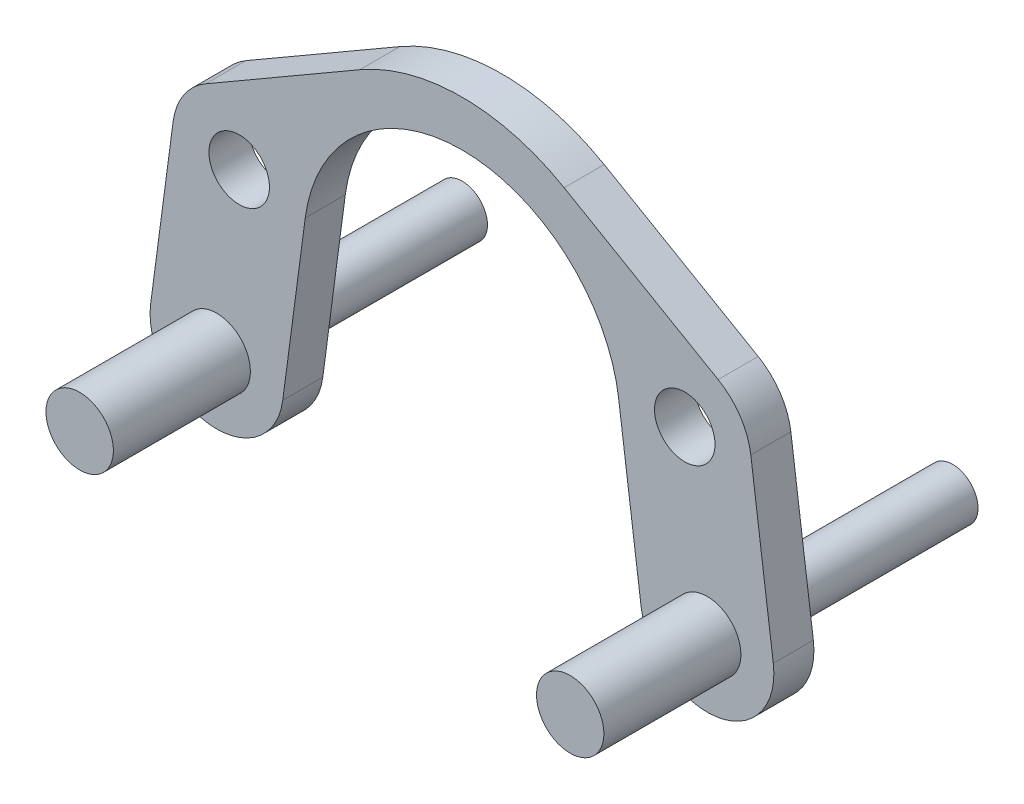
ISO-10303-21;
HEADER;
FILE_DESCRIPTION(('STEP AP214'),'2;1');
FILE_NAME('part.step','',(''),(''),'','','');
FILE_SCHEMA(('AUTOMOTIVE_DESIGN { 1 0 10303 214 1 1 1 1 }'));
ENDSEC;
DATA;
#1=APPLICATION_CONTEXT('core data for automotive mechanical design processes');
#2=APPLICATION_PROTOCOL_DEFINITION('international standard','automotive_design',2000,#1);
#3=PRODUCT_CONTEXT('',#1,'mechanical');
#4=PRODUCT('Part','Part','',(#3));
#5=PRODUCT_RELATED_PRODUCT_CATEGORY('part','',(#4));
#6=PRODUCT_DEFINITION_FORMATION('','',#4);
#7=PRODUCT_DEFINITION_CONTEXT('part definition',#1,'design');
#8=PRODUCT_DEFINITION('design','',#6,#7);
#9=PRODUCT_DEFINITION_SHAPE('','',#8);
#10=(LENGTH_UNIT() NAMED_UNIT(*) SI_UNIT(.MILLI.,.METRE.));
#11=(NAMED_UNIT(*) PLANE_ANGLE_UNIT() SI_UNIT($,.RADIAN.));
#12=(NAMED_UNIT(*) SI_UNIT($,.STERADIAN.) SOLID_ANGLE_UNIT());
#13=UNCERTAINTY_MEASURE_WITH_UNIT(LENGTH_MEASURE(1.E-05),#10,'distance_accuracy_value','');
#14=(GEOMETRIC_REPRESENTATION_CONTEXT(3) GLOBAL_UNCERTAINTY_ASSIGNED_CONTEXT((#13)) GLOBAL_UNIT_ASSIGNED_CONTEXT((#10,
#11,#12)) REPRESENTATION_CONTEXT('',''));
#15=CARTESIAN_POINT('',(0.,0.,0.));
#16=DIRECTION('',(0.,0.,1.));
#17=DIRECTION('',(1.,0.,0.));
#18=AXIS2_PLACEMENT_3D('',#15,#16,#17);
#19=CARTESIAN_POINT('',(0.,21.6913852657005,6.223));
#20=DIRECTION('',(0.,0.,1.));
#21=DIRECTION('',(1.,0.,0.));
#22=AXIS2_PLACEMENT_3D('',#19,#20,#21);
#23=PLANE('',#22);
#24=CARTESIAN_POINT('',(-38.1,0.,6.223));
#25=DIRECTION('',(0.,0.,1.));
#26=DIRECTION('',(1.,0.,0.));
#27=AXIS2_PLACEMENT_3D('',#24,#25,#26);
#28=CIRCLE('',#27,5.2324);
#29=CARTESIAN_POINT('',(-32.8676,0.,6.223));
#30=VERTEX_POINT('',#29);
#31=EDGE_CURVE('E41',#30,#30,#28,.T.);
#32=ORIENTED_EDGE('',*,*,#31,.F.);
#33=EDGE_LOOP('',(#32));
#34=FACE_BOUND('',#33,.T.);
#35=CARTESIAN_POINT('',(38.1,0.,6.223));
#36=DIRECTION('',(0.,0.,1.));
#37=DIRECTION('',(1.,0.,0.));
#38=AXIS2_PLACEMENT_3D('',#35,#36,#37);
#39=CIRCLE('',#38,5.2324);
#40=CARTESIAN_POINT('',(43.3324,0.,6.223));
#41=VERTEX_POINT('',#40);
#42=EDGE_CURVE('E216',#41,#41,#39,.T.);
#43=ORIENTED_EDGE('',*,*,#42,.F.);
#44=EDGE_LOOP('',(#43));
#45=FACE_BOUND('',#44,.T.);
#46=CARTESIAN_POINT('',(34.6075,26.289,6.223));
#47=DIRECTION('',(0.,0.,1.));
#48=DIRECTION('',(1.,0.,0.));
#49=AXIS2_PLACEMENT_3D('',#46,#47,#48);
#50=CIRCLE('',#49,4.699);
#51=CARTESIAN_POINT('',(39.3065,26.289,6.223));
#52=VERTEX_POINT('',#51);
#53=EDGE_CURVE('E158',#52,#52,#50,.T.);
#54=ORIENTED_EDGE('',*,*,#53,.F.);
#55=EDGE_LOOP('',(#54));
#56=FACE_BOUND('',#55,.T.);
#57=CARTESIAN_POINT('',(0.,21.6913852657005,6.223));
#58=DIRECTION('',(0.,0.,1.));
#59=DIRECTION('',(1.,0.,0.));
#60=AXIS2_PLACEMENT_3D('',#57,#58,#59);
#61=CIRCLE('',#60,31.6730613729183);
#62=CARTESIAN_POINT('',(15.8733700176392,49.0997588222573,6.223));
#63=VERTEX_POINT('',#62);
#64=CARTESIAN_POINT('',(-15.8733700176392,49.0997588222573,6.223));
#65=VERTEX_POINT('',#64);
#66=EDGE_CURVE('E178',#63,#65,#61,.T.);
#67=ORIENTED_EDGE('',*,*,#66,.T.);
#68=DIRECTION('',(-0.865352838295323,-0.501163112423718,0.));
#69=VECTOR('',#68,1.);
#70=CARTESIAN_POINT('',(-15.8733700176392,49.0997588222573,6.223));
#71=LINE('',#70,#69);
#72=CARTESIAN_POINT('',(-39.7947887951417,35.2458345527757,6.223));
#73=VERTEX_POINT('',#72);
#74=EDGE_CURVE('E105',#65,#73,#71,.T.);
#75=ORIENTED_EDGE('',*,*,#74,.T.);
#76=CARTESIAN_POINT('',(-34.6075,26.289,6.223));
#77=DIRECTION('',(0.,0.,1.));
#78=DIRECTION('',(-1.,0.,0.));
#79=AXIS2_PLACEMENT_3D('',#76,#77,#78);
#80=CIRCLE('',#79,10.3505);
#81=CARTESIAN_POINT('',(-44.8678525784403,27.6520903183918,6.223));
#82=VERTEX_POINT('',#81);
#83=EDGE_CURVE('E231',#73,#82,#80,.T.);
#84=ORIENTED_EDGE('',*,*,#83,.T.);
#85=DIRECTION('',(-0.131693185681061,-0.991290524944717,0.));
#86=VECTOR('',#85,1.);
#87=CARTESIAN_POINT('',(-48.3603525784403,1.36309031839182,6.223));
#88=LINE('',#87,#86);
#89=CARTESIAN_POINT('',(-48.3603525784403,1.36309031839182,6.223));
#90=VERTEX_POINT('',#89);
#91=EDGE_CURVE('E233',#82,#90,#88,.T.);
#92=ORIENTED_EDGE('',*,*,#91,.T.);
#93=CARTESIAN_POINT('',(-38.1,0.,6.223));
#94=DIRECTION('',(0.,0.,1.));
#95=DIRECTION('',(-1.,0.,0.));
#96=AXIS2_PLACEMENT_3D('',#93,#94,#95);
#97=CIRCLE('',#96,10.3505);
#98=CARTESIAN_POINT('',(-27.8396474215597,-1.36309031839182,6.223));
#99=VERTEX_POINT('',#98);
#100=EDGE_CURVE('E235',#90,#99,#97,.T.);
#101=ORIENTED_EDGE('',*,*,#100,.T.);
#102=DIRECTION('',(0.131693185681062,0.991290524944717,0.));
#103=VECTOR('',#102,1.);
#104=CARTESIAN_POINT('',(-27.8396474215597,-1.36309031839183,6.223));
#105=LINE('',#104,#103);
#106=CARTESIAN_POINT('',(-24.3471474215597,24.9259096816082,6.223));
#107=VERTEX_POINT('',#106);
#108=EDGE_CURVE('E237',#99,#107,#105,.T.);
#109=ORIENTED_EDGE('',*,*,#108,.T.);
#110=CARTESIAN_POINT('',(0.,21.6913852657005,6.223));
#111=DIRECTION('',(0.,0.,-1.));
#112=DIRECTION('',(-1.,0.,0.));
#113=AXIS2_PLACEMENT_3D('',#110,#111,#112);
#114=CIRCLE('',#113,24.5610613729184);
#115=CARTESIAN_POINT('',(24.3471474215597,24.9259096816082,6.223));
#116=VERTEX_POINT('',#115);
#117=EDGE_CURVE('E239',#107,#116,#114,.T.);
#118=ORIENTED_EDGE('',*,*,#117,.T.);
#119=DIRECTION('',(0.131693185681062,-0.991290524944717,0.));
#120=VECTOR('',#119,1.);
#121=CARTESIAN_POINT('',(27.8396474215597,-1.36309031839183,6.223));
#122=LINE('',#121,#120);
#123=CARTESIAN_POINT('',(27.8396474215597,-1.36309031839183,6.223));
#124=VERTEX_POINT('',#123);
#125=EDGE_CURVE('E241',#116,#124,#122,.T.);
#126=ORIENTED_EDGE('',*,*,#125,.T.);
#127=CARTESIAN_POINT('',(38.1,0.,6.223));
#128=DIRECTION('',(0.,0.,1.));
#129=DIRECTION('',(1.,0.,0.));
#130=AXIS2_PLACEMENT_3D('',#127,#128,#129);
#131=CIRCLE('',#130,10.3505);
#132=CARTESIAN_POINT('',(48.3603525784403,1.36309031839182,6.223));
#133=VERTEX_POINT('',#132);
#134=EDGE_CURVE('E136',#124,#133,#131,.T.);
#135=ORIENTED_EDGE('',*,*,#134,.T.);
#136=DIRECTION('',(-0.131693185681061,0.991290524944717,0.));
#137=VECTOR('',#136,1.);
#138=CARTESIAN_POINT('',(48.3603525784403,1.36309031839182,6.223));
#139=LINE('',#138,#137);
#140=CARTESIAN_POINT('',(44.8678525784403,27.6520903183918,6.223));
#141=VERTEX_POINT('',#140);
#142=EDGE_CURVE('E130',#133,#141,#139,.T.);
#143=ORIENTED_EDGE('',*,*,#142,.T.);
#144=CARTESIAN_POINT('',(34.6075,26.289,6.223));
#145=DIRECTION('',(0.,0.,1.));
#146=DIRECTION('',(1.,0.,0.));
#147=AXIS2_PLACEMENT_3D('',#144,#145,#146);
#148=CIRCLE('',#147,10.3505);
#149=CARTESIAN_POINT('',(39.7947887951417,35.2458345527757,6.223));
#150=VERTEX_POINT('',#149);
#151=EDGE_CURVE('E134',#141,#150,#148,.T.);
#152=ORIENTED_EDGE('',*,*,#151,.T.);
#153=DIRECTION('',(-0.865352838295323,0.501163112423718,0.));
#154=VECTOR('',#153,1.);
#155=CARTESIAN_POINT('',(15.8733700176392,49.0997588222573,6.223));
#156=LINE('',#155,#154);
#157=EDGE_CURVE('E49',#150,#63,#156,.T.);
#158=ORIENTED_EDGE('',*,*,#157,.T.);
#159=EDGE_LOOP('',(#67,#75,#84,#92,#101,#109,#118,#126,#135,#143,#152,#158));
#160=FACE_BOUND('',#159,.T.);
#161=CARTESIAN_POINT('',(-34.6075,26.289,6.223));
#162=DIRECTION('',(0.,0.,1.));
#163=DIRECTION('',(-1.,0.,0.));
#164=AXIS2_PLACEMENT_3D('',#161,#162,#163);
#165=CIRCLE('',#164,4.699);
#166=CARTESIAN_POINT('',(-39.3065,26.289,6.223));
#167=VERTEX_POINT('',#166);
#168=EDGE_CURVE('E223',#167,#167,#165,.T.);
#169=ORIENTED_EDGE('',*,*,#168,.F.);
#170=EDGE_LOOP('',(#169));
#171=FACE_BOUND('',#170,.T.);
#172=ADVANCED_FACE('F32',(#34,#45,#56,#160,#171),#23,.T.);
#173=CARTESIAN_POINT('',(0.,21.6913852657005,0.));
#174=DIRECTION('',(0.,0.,1.));
#175=DIRECTION('',(1.,0.,0.));
#176=AXIS2_PLACEMENT_3D('',#173,#174,#175);
#177=PLANE('',#176);
#178=CARTESIAN_POINT('',(38.1,0.,0.));
#179=DIRECTION('',(0.,0.,1.));
#180=DIRECTION('',(1.,0.,0.));
#181=AXIS2_PLACEMENT_3D('',#178,#179,#180);
#182=CIRCLE('',#181,3.937);
#183=CARTESIAN_POINT('',(42.037,0.,0.));
#184=VERTEX_POINT('',#183);
#185=EDGE_CURVE('E322',#184,#184,#182,.T.);
#186=ORIENTED_EDGE('',*,*,#185,.T.);
#187=EDGE_LOOP('',(#186));
#188=FACE_BOUND('',#187,.T.);
#189=CARTESIAN_POINT('',(-38.1,0.,0.));
#190=DIRECTION('',(0.,0.,1.));
#191=DIRECTION('',(1.,0.,0.));
#192=AXIS2_PLACEMENT_3D('',#189,#190,#191);
#193=CIRCLE('',#192,3.937);
#194=CARTESIAN_POINT('',(-34.163,0.,0.));
#195=VERTEX_POINT('',#194);
#196=EDGE_CURVE('E11',#195,#195,#193,.F.);
#197=ORIENTED_EDGE('',*,*,#196,.F.);
#198=EDGE_LOOP('',(#197));
#199=FACE_BOUND('',#198,.T.);
#200=CARTESIAN_POINT('',(0.,21.6913852657005,0.));
#201=DIRECTION('',(0.,0.,1.));
#202=DIRECTION('',(1.,0.,0.));
#203=AXIS2_PLACEMENT_3D('',#200,#201,#202);
#204=CIRCLE('',#203,31.6730613729183);
#205=CARTESIAN_POINT('',(15.8733700176392,49.0997588222573,0.));
#206=VERTEX_POINT('',#205);
#207=CARTESIAN_POINT('',(-15.8733700176392,49.0997588222573,0.));
#208=VERTEX_POINT('',#207);
#209=EDGE_CURVE('E154',#206,#208,#204,.T.);
#210=ORIENTED_EDGE('',*,*,#209,.F.);
#211=DIRECTION('',(-0.865352838295323,0.501163112423718,0.));
#212=VECTOR('',#211,1.);
#213=CARTESIAN_POINT('',(15.8733700176392,49.0997588222573,0.));
#214=LINE('',#213,#212);
#215=CARTESIAN_POINT('',(39.7947887951417,35.2458345527757,0.));
#216=VERTEX_POINT('',#215);
#217=EDGE_CURVE('E96',#216,#206,#214,.T.);
#218=ORIENTED_EDGE('',*,*,#217,.F.);
#219=CARTESIAN_POINT('',(34.6075,26.289,0.));
#220=DIRECTION('',(0.,0.,1.));
#221=DIRECTION('',(1.,0.,0.));
#222=AXIS2_PLACEMENT_3D('',#219,#220,#221);
#223=CIRCLE('',#222,10.3505);
#224=CARTESIAN_POINT('',(44.8678525784403,27.6520903183918,0.));
#225=VERTEX_POINT('',#224);
#226=EDGE_CURVE('E90',#225,#216,#223,.T.);
#227=ORIENTED_EDGE('',*,*,#226,.F.);
#228=DIRECTION('',(-0.131693185681061,0.991290524944717,0.));
#229=VECTOR('',#228,1.);
#230=CARTESIAN_POINT('',(48.3603525784403,1.36309031839182,0.));
#231=LINE('',#230,#229);
#232=CARTESIAN_POINT('',(48.3603525784403,1.36309031839182,0.));
#233=VERTEX_POINT('',#232);
#234=EDGE_CURVE('E144',#233,#225,#231,.T.);
#235=ORIENTED_EDGE('',*,*,#234,.F.);
#236=CARTESIAN_POINT('',(38.1,0.,0.));
#237=DIRECTION('',(0.,0.,1.));
#238=DIRECTION('',(1.,0.,0.));
#239=AXIS2_PLACEMENT_3D('',#236,#237,#238);
#240=CIRCLE('',#239,10.3505);
#241=CARTESIAN_POINT('',(27.8396474215597,-1.36309031839183,0.));
#242=VERTEX_POINT('',#241);
#243=EDGE_CURVE('E173',#242,#233,#240,.T.);
#244=ORIENTED_EDGE('',*,*,#243,.F.);
#245=DIRECTION('',(0.131693185681062,-0.991290524944717,0.));
#246=VECTOR('',#245,1.);
#247=CARTESIAN_POINT('',(27.8396474215597,-1.36309031839183,0.));
#248=LINE('',#247,#246);
#249=CARTESIAN_POINT('',(24.3471474215597,24.9259096816082,0.));
#250=VERTEX_POINT('',#249);
#251=EDGE_CURVE('E171',#250,#242,#248,.T.);
#252=ORIENTED_EDGE('',*,*,#251,.F.);
#253=CARTESIAN_POINT('',(0.,21.6913852657005,0.));
#254=DIRECTION('',(0.,0.,-1.));
#255=DIRECTION('',(1.,0.,0.));
#256=AXIS2_PLACEMENT_3D('',#253,#254,#255);
#257=CIRCLE('',#256,24.5610613729184);
#258=CARTESIAN_POINT('',(-24.3471474215597,24.9259096816082,0.));
#259=VERTEX_POINT('',#258);
#260=EDGE_CURVE('E169',#259,#250,#257,.T.);
#261=ORIENTED_EDGE('',*,*,#260,.F.);
#262=DIRECTION('',(0.131693185681062,0.991290524944717,0.));
#263=VECTOR('',#262,1.);
#264=CARTESIAN_POINT('',(-27.8396474215597,-1.36309031839183,0.));
#265=LINE('',#264,#263);
#266=CARTESIAN_POINT('',(-27.8396474215597,-1.36309031839182,0.));
#267=VERTEX_POINT('',#266);
#268=EDGE_CURVE('E166',#267,#259,#265,.T.);
#269=ORIENTED_EDGE('',*,*,#268,.F.);
#270=CARTESIAN_POINT('',(-38.1,0.,0.));
#271=DIRECTION('',(0.,0.,1.));
#272=DIRECTION('',(-1.,0.,0.));
#273=AXIS2_PLACEMENT_3D('',#270,#271,#272);
#274=CIRCLE('',#273,10.3505);
#275=CARTESIAN_POINT('',(-48.3603525784403,1.36309031839182,0.));
#276=VERTEX_POINT('',#275);
#277=EDGE_CURVE('E164',#276,#267,#274,.T.);
#278=ORIENTED_EDGE('',*,*,#277,.F.);
#279=DIRECTION('',(-0.131693185681061,-0.991290524944717,0.));
#280=VECTOR('',#279,1.);
#281=CARTESIAN_POINT('',(-48.3603525784403,1.36309031839182,0.));
#282=LINE('',#281,#280);
#283=CARTESIAN_POINT('',(-44.8678525784403,27.6520903183918,0.));
#284=VERTEX_POINT('',#283);
#285=EDGE_CURVE('E162',#284,#276,#282,.T.);
#286=ORIENTED_EDGE('',*,*,#285,.F.);
#287=CARTESIAN_POINT('',(-34.6075,26.289,0.));
#288=DIRECTION('',(0.,0.,1.));
#289=DIRECTION('',(-1.,0.,0.));
#290=AXIS2_PLACEMENT_3D('',#287,#288,#289);
#291=CIRCLE('',#290,10.3505);
#292=CARTESIAN_POINT('',(-39.7947887951417,35.2458345527757,0.));
#293=VERTEX_POINT('',#292);
#294=EDGE_CURVE('E160',#293,#284,#291,.T.);
#295=ORIENTED_EDGE('',*,*,#294,.F.);
#296=DIRECTION('',(-0.865352838295323,-0.501163112423718,0.));
#297=VECTOR('',#296,1.);
#298=CARTESIAN_POINT('',(-15.8733700176392,49.0997588222573,0.));
#299=LINE('',#298,#297);
#300=EDGE_CURVE('E157',#208,#293,#299,.T.);
#301=ORIENTED_EDGE('',*,*,#300,.F.);
#302=EDGE_LOOP('',(#210,#218,#227,#235,#244,#252,#261,#269,#278,#286,#295,#301));
#303=FACE_BOUND('',#302,.T.);
#304=CARTESIAN_POINT('',(34.6075,26.289,0.));
#305=DIRECTION('',(0.,0.,1.));
#306=DIRECTION('',(1.,0.,0.));
#307=AXIS2_PLACEMENT_3D('',#304,#305,#306);
#308=CIRCLE('',#307,4.699);
#309=CARTESIAN_POINT('',(39.3065,26.289,0.));
#310=VERTEX_POINT('',#309);
#311=EDGE_CURVE('E220',#310,#310,#308,.T.);
#312=ORIENTED_EDGE('',*,*,#311,.T.);
#313=EDGE_LOOP('',(#312));
#314=FACE_BOUND('',#313,.T.);
#315=CARTESIAN_POINT('',(-34.6075,26.289,0.));
#316=DIRECTION('',(0.,0.,1.));
#317=DIRECTION('',(-1.,0.,0.));
#318=AXIS2_PLACEMENT_3D('',#315,#316,#317);
#319=CIRCLE('',#318,4.699);
#320=CARTESIAN_POINT('',(-39.3065,26.289,0.));
#321=VERTEX_POINT('',#320);
#322=EDGE_CURVE('E226',#321,#321,#319,.T.);
#323=ORIENTED_EDGE('',*,*,#322,.T.);
#324=EDGE_LOOP('',(#323));
#325=FACE_BOUND('',#324,.T.);
#326=ADVANCED_FACE('F211',(#188,#199,#303,#314,#325),#177,.F.);
#327=CARTESIAN_POINT('',(0.,21.6913852657005,6.223));
#328=DIRECTION('',(0.,0.,-1.));
#329=DIRECTION('',(-1.,0.,0.));
#330=AXIS2_PLACEMENT_3D('',#327,#328,#329);
#331=CYLINDRICAL_SURFACE('',#330,31.6730613729183);
#332=ORIENTED_EDGE('',*,*,#209,.T.);
#333=DIRECTION('',(0.,0.,-1.));
#334=VECTOR('',#333,1.);
#335=CARTESIAN_POINT('',(-15.8733700176392,49.0997588222573,6.223));
#336=LINE('',#335,#334);
#337=EDGE_CURVE('E203',#65,#208,#336,.T.);
#338=ORIENTED_EDGE('',*,*,#337,.F.);
#339=ORIENTED_EDGE('',*,*,#66,.F.);
#340=DIRECTION('',(0.,0.,-1.));
#341=VECTOR('',#340,1.);
#342=CARTESIAN_POINT('',(15.8733700176392,49.0997588222573,6.223));
#343=LINE('',#342,#341);
#344=EDGE_CURVE('E150',#63,#206,#343,.T.);
#345=ORIENTED_EDGE('',*,*,#344,.T.);
#346=EDGE_LOOP('',(#332,#338,#339,#345));
#347=FACE_BOUND('',#346,.T.);
#348=ADVANCED_FACE('F34',(#347),#331,.T.);
#349=CARTESIAN_POINT('',(-15.8733700176392,49.0997588222573,6.223));
#350=DIRECTION('',(0.501163112423718,-0.865352838295323,0.));
#351=DIRECTION('',(0.865352838295323,0.501163112423718,0.));
#352=AXIS2_PLACEMENT_3D('',#349,#350,#351);
#353=PLANE('',#352);
#354=ORIENTED_EDGE('',*,*,#300,.T.);
#355=DIRECTION('',(0.,0.,-1.));
#356=VECTOR('',#355,1.);
#357=CARTESIAN_POINT('',(-39.7947887951417,35.2458345527757,6.223));
#358=LINE('',#357,#356);
#359=EDGE_CURVE('E200',#73,#293,#358,.T.);
#360=ORIENTED_EDGE('',*,*,#359,.F.);
#361=ORIENTED_EDGE('',*,*,#74,.F.);
#362=ORIENTED_EDGE('',*,*,#337,.T.);
#363=EDGE_LOOP('',(#354,#360,#361,#362));
#364=FACE_BOUND('',#363,.T.);
#365=ADVANCED_FACE('F296',(#364),#353,.F.);
#366=CARTESIAN_POINT('',(-34.6075,26.289,6.223));
#367=DIRECTION('',(0.,0.,-1.));
#368=DIRECTION('',(-1.,0.,0.));
#369=AXIS2_PLACEMENT_3D('',#366,#367,#368);
#370=CYLINDRICAL_SURFACE('',#369,10.3505);
#371=ORIENTED_EDGE('',*,*,#294,.T.);
#372=DIRECTION('',(0.,0.,-1.));
#373=VECTOR('',#372,1.);
#374=CARTESIAN_POINT('',(-44.8678525784403,27.6520903183918,6.223));
#375=LINE('',#374,#373);
#376=EDGE_CURVE('E197',#82,#284,#375,.T.);
#377=ORIENTED_EDGE('',*,*,#376,.F.);
#378=ORIENTED_EDGE('',*,*,#83,.F.);
#379=ORIENTED_EDGE('',*,*,#359,.T.);
#380=EDGE_LOOP('',(#371,#377,#378,#379));
#381=FACE_BOUND('',#380,.T.);
#382=ADVANCED_FACE('F293',(#381),#370,.T.);
#383=CARTESIAN_POINT('',(-48.3603525784403,1.36309031839182,6.223));
#384=DIRECTION('',(0.991290524944717,-0.131693185681061,0.));
#385=DIRECTION('',(0.131693185681061,0.991290524944717,0.));
#386=AXIS2_PLACEMENT_3D('',#383,#384,#385);
#387=PLANE('',#386);
#388=ORIENTED_EDGE('',*,*,#285,.T.);
#389=DIRECTION('',(0.,0.,-1.));
#390=VECTOR('',#389,1.);
#391=CARTESIAN_POINT('',(-48.3603525784403,1.36309031839182,6.223));
#392=LINE('',#391,#390);
#393=EDGE_CURVE('E194',#90,#276,#392,.T.);
#394=ORIENTED_EDGE('',*,*,#393,.F.);
#395=ORIENTED_EDGE('',*,*,#91,.F.);
#396=ORIENTED_EDGE('',*,*,#376,.T.);
#397=EDGE_LOOP('',(#388,#394,#395,#396));
#398=FACE_BOUND('',#397,.T.);
#399=ADVANCED_FACE('F289',(#398),#387,.F.);
#400=CARTESIAN_POINT('',(-38.1,0.,6.223));
#401=DIRECTION('',(0.,0.,-1.));
#402=DIRECTION('',(-1.,0.,0.));
#403=AXIS2_PLACEMENT_3D('',#400,#401,#402);
#404=CYLINDRICAL_SURFACE('',#403,10.3505);
#405=ORIENTED_EDGE('',*,*,#277,.T.);
#406=DIRECTION('',(0.,0.,-1.));
#407=VECTOR('',#406,1.);
#408=CARTESIAN_POINT('',(-27.8396474215597,-1.36309031839182,6.223));
#409=LINE('',#408,#407);
#410=EDGE_CURVE('E191',#99,#267,#409,.T.);
#411=ORIENTED_EDGE('',*,*,#410,.F.);
#412=ORIENTED_EDGE('',*,*,#100,.F.);
#413=ORIENTED_EDGE('',*,*,#393,.T.);
#414=EDGE_LOOP('',(#405,#411,#412,#413));
#415=FACE_BOUND('',#414,.T.);
#416=ADVANCED_FACE('F285',(#415),#404,.T.);
#417=CARTESIAN_POINT('',(-27.8396474215597,-1.36309031839183,6.223));
#418=DIRECTION('',(-0.991290524944717,0.131693185681062,0.));
#419=DIRECTION('',(-0.131693185681062,-0.991290524944717,0.));
#420=AXIS2_PLACEMENT_3D('',#417,#418,#419);
#421=PLANE('',#420);
#422=ORIENTED_EDGE('',*,*,#268,.T.);
#423=DIRECTION('',(0.,0.,-1.));
#424=VECTOR('',#423,1.);
#425=CARTESIAN_POINT('',(-24.3471474215597,24.9259096816082,6.223));
#426=LINE('',#425,#424);
#427=EDGE_CURVE('E188',#107,#259,#426,.T.);
#428=ORIENTED_EDGE('',*,*,#427,.F.);
#429=ORIENTED_EDGE('',*,*,#108,.F.);
#430=ORIENTED_EDGE('',*,*,#410,.T.);
#431=EDGE_LOOP('',(#422,#428,#429,#430));
#432=FACE_BOUND('',#431,.T.);
#433=ADVANCED_FACE('F281',(#432),#421,.F.);
#434=CARTESIAN_POINT('',(0.,21.6913852657005,6.223));
#435=DIRECTION('',(0.,0.,-1.));
#436=DIRECTION('',(-1.,0.,0.));
#437=AXIS2_PLACEMENT_3D('',#434,#435,#436);
#438=CYLINDRICAL_SURFACE('',#437,24.5610613729184);
#439=ORIENTED_EDGE('',*,*,#260,.T.);
#440=DIRECTION('',(0.,0.,-1.));
#441=VECTOR('',#440,1.);
#442=CARTESIAN_POINT('',(24.3471474215597,24.9259096816082,6.223));
#443=LINE('',#442,#441);
#444=EDGE_CURVE('E185',#116,#250,#443,.T.);
#445=ORIENTED_EDGE('',*,*,#444,.F.);
#446=ORIENTED_EDGE('',*,*,#117,.F.);
#447=ORIENTED_EDGE('',*,*,#427,.T.);
#448=EDGE_LOOP('',(#439,#445,#446,#447));
#449=FACE_BOUND('',#448,.T.);
#450=ADVANCED_FACE('F278',(#449),#438,.F.);
#451=CARTESIAN_POINT('',(27.8396474215597,-1.36309031839183,6.223));
#452=DIRECTION('',(0.991290524944717,0.131693185681062,0.));
#453=DIRECTION('',(-0.131693185681062,0.991290524944717,0.));
#454=AXIS2_PLACEMENT_3D('',#451,#452,#453);
#455=PLANE('',#454);
#456=ORIENTED_EDGE('',*,*,#251,.T.);
#457=DIRECTION('',(0.,0.,-1.));
#458=VECTOR('',#457,1.);
#459=CARTESIAN_POINT('',(27.8396474215597,-1.36309031839183,6.223));
#460=LINE('',#459,#458);
#461=EDGE_CURVE('E182',#124,#242,#460,.T.);
#462=ORIENTED_EDGE('',*,*,#461,.F.);
#463=ORIENTED_EDGE('',*,*,#125,.F.);
#464=ORIENTED_EDGE('',*,*,#444,.T.);
#465=EDGE_LOOP('',(#456,#462,#463,#464));
#466=FACE_BOUND('',#465,.T.);
#467=ADVANCED_FACE('F247',(#466),#455,.F.);
#468=CARTESIAN_POINT('',(38.1,0.,6.223));
#469=DIRECTION('',(0.,0.,-1.));
#470=DIRECTION('',(-1.,0.,0.));
#471=AXIS2_PLACEMENT_3D('',#468,#469,#470);
#472=CYLINDRICAL_SURFACE('',#471,10.3505);
#473=ORIENTED_EDGE('',*,*,#243,.T.);
#474=DIRECTION('',(0.,0.,-1.));
#475=VECTOR('',#474,1.);
#476=CARTESIAN_POINT('',(48.3603525784403,1.36309031839182,6.223));
#477=LINE('',#476,#475);
#478=EDGE_CURVE('E145',#133,#233,#477,.T.);
#479=ORIENTED_EDGE('',*,*,#478,.F.);
#480=ORIENTED_EDGE('',*,*,#134,.F.);
#481=ORIENTED_EDGE('',*,*,#461,.T.);
#482=EDGE_LOOP('',(#473,#479,#480,#481));
#483=FACE_BOUND('',#482,.T.);
#484=ADVANCED_FACE('F251',(#483),#472,.T.);
#485=CARTESIAN_POINT('',(48.3603525784403,1.36309031839182,6.223));
#486=DIRECTION('',(-0.991290524944717,-0.131693185681061,0.));
#487=DIRECTION('',(0.131693185681061,-0.991290524944717,0.));
#488=AXIS2_PLACEMENT_3D('',#485,#486,#487);
#489=PLANE('',#488);
#490=ORIENTED_EDGE('',*,*,#234,.T.);
#491=DIRECTION('',(0.,0.,-1.));
#492=VECTOR('',#491,1.);
#493=CARTESIAN_POINT('',(44.8678525784403,27.6520903183918,6.223));
#494=LINE('',#493,#492);
#495=EDGE_CURVE('E141',#141,#225,#494,.T.);
#496=ORIENTED_EDGE('',*,*,#495,.F.);
#497=ORIENTED_EDGE('',*,*,#142,.F.);
#498=ORIENTED_EDGE('',*,*,#478,.T.);
#499=EDGE_LOOP('',(#490,#496,#497,#498));
#500=FACE_BOUND('',#499,.T.);
#501=ADVANCED_FACE('F142',(#500),#489,.F.);
#502=CARTESIAN_POINT('',(34.6075,26.289,6.223));
#503=DIRECTION('',(0.,0.,-1.));
#504=DIRECTION('',(-1.,0.,0.));
#505=AXIS2_PLACEMENT_3D('',#502,#503,#504);
#506=CYLINDRICAL_SURFACE('',#505,10.3505);
#507=ORIENTED_EDGE('',*,*,#226,.T.);
#508=DIRECTION('',(0.,0.,-1.));
#509=VECTOR('',#508,1.);
#510=CARTESIAN_POINT('',(39.7947887951417,35.2458345527757,6.223));
#511=LINE('',#510,#509);
#512=EDGE_CURVE('E146',#150,#216,#511,.T.);
#513=ORIENTED_EDGE('',*,*,#512,.F.);
#514=ORIENTED_EDGE('',*,*,#151,.F.);
#515=ORIENTED_EDGE('',*,*,#495,.T.);
#516=EDGE_LOOP('',(#507,#513,#514,#515));
#517=FACE_BOUND('',#516,.T.);
#518=ADVANCED_FACE('F148',(#517),#506,.T.);
#519=CARTESIAN_POINT('',(15.8733700176392,49.0997588222573,6.223));
#520=DIRECTION('',(-0.501163112423718,-0.865352838295323,0.));
#521=DIRECTION('',(0.865352838295323,-0.501163112423718,0.));
#522=AXIS2_PLACEMENT_3D('',#519,#520,#521);
#523=PLANE('',#522);
#524=ORIENTED_EDGE('',*,*,#217,.T.);
#525=ORIENTED_EDGE('',*,*,#344,.F.);
#526=ORIENTED_EDGE('',*,*,#157,.F.);
#527=ORIENTED_EDGE('',*,*,#512,.T.);
#528=EDGE_LOOP('',(#524,#525,#526,#527));
#529=FACE_BOUND('',#528,.T.);
#530=ADVANCED_FACE('F259',(#529),#523,.F.);
#531=CARTESIAN_POINT('',(34.6075,26.289,6.223));
#532=DIRECTION('',(0.,0.,-1.));
#533=DIRECTION('',(-1.,0.,0.));
#534=AXIS2_PLACEMENT_3D('',#531,#532,#533);
#535=CYLINDRICAL_SURFACE('',#534,4.699);
#536=ORIENTED_EDGE('',*,*,#53,.T.);
#537=EDGE_LOOP('',(#536));
#538=FACE_BOUND('',#537,.T.);
#539=ORIENTED_EDGE('',*,*,#311,.F.);
#540=EDGE_LOOP('',(#539));
#541=FACE_BOUND('',#540,.T.);
#542=ADVANCED_FACE('F261',(#538,#541),#535,.F.);
#543=CARTESIAN_POINT('',(-34.6075,26.289,6.223));
#544=DIRECTION('',(0.,0.,-1.));
#545=DIRECTION('',(-1.,0.,0.));
#546=AXIS2_PLACEMENT_3D('',#543,#544,#545);
#547=CYLINDRICAL_SURFACE('',#546,4.699);
#548=ORIENTED_EDGE('',*,*,#168,.T.);
#549=EDGE_LOOP('',(#548));
#550=FACE_BOUND('',#549,.T.);
#551=ORIENTED_EDGE('',*,*,#322,.F.);
#552=EDGE_LOOP('',(#551));
#553=FACE_BOUND('',#552,.T.);
#554=ADVANCED_FACE('F267',(#550,#553),#547,.F.);
#555=CARTESIAN_POINT('',(38.1,0.,27.5082));
#556=DIRECTION('',(0.,0.,-1.));
#557=DIRECTION('',(-1.,0.,0.));
#558=AXIS2_PLACEMENT_3D('',#555,#556,#557);
#559=CYLINDRICAL_SURFACE('',#558,5.2324);
#560=CARTESIAN_POINT('',(38.1,0.,27.5082));
#561=DIRECTION('',(0.,0.,1.));
#562=DIRECTION('',(1.,0.,0.));
#563=AXIS2_PLACEMENT_3D('',#560,#561,#562);
#564=CIRCLE('',#563,5.2324);
#565=CARTESIAN_POINT('',(43.3324,0.,27.5082));
#566=VERTEX_POINT('',#565);
#567=EDGE_CURVE('E364',#566,#566,#564,.T.);
#568=ORIENTED_EDGE('',*,*,#567,.F.);
#569=EDGE_LOOP('',(#568));
#570=FACE_BOUND('',#569,.T.);
#571=ORIENTED_EDGE('',*,*,#42,.T.);
#572=EDGE_LOOP('',(#571));
#573=FACE_BOUND('',#572,.T.);
#574=ADVANCED_FACE('F349',(#570,#573),#559,.T.);
#575=CARTESIAN_POINT('',(38.1,0.,27.5082));
#576=DIRECTION('',(0.,0.,1.));
#577=DIRECTION('',(1.,0.,0.));
#578=AXIS2_PLACEMENT_3D('',#575,#576,#577);
#579=PLANE('',#578);
#580=ORIENTED_EDGE('',*,*,#567,.T.);
#581=EDGE_LOOP('',(#580));
#582=FACE_BOUND('',#581,.T.);
#583=ADVANCED_FACE('F345',(#582),#579,.T.);
#584=CARTESIAN_POINT('',(-38.1,0.,27.5082));
#585=DIRECTION('',(0.,0.,-1.));
#586=DIRECTION('',(-1.,0.,0.));
#587=AXIS2_PLACEMENT_3D('',#584,#585,#586);
#588=CYLINDRICAL_SURFACE('',#587,5.2324);
#589=CARTESIAN_POINT('',(-38.1,0.,27.5082));
#590=DIRECTION('',(0.,0.,-1.));
#591=DIRECTION('',(-1.,0.,0.));
#592=AXIS2_PLACEMENT_3D('',#589,#590,#591);
#593=CIRCLE('',#592,5.2324);
#594=CARTESIAN_POINT('',(-43.3324,0.,27.5082));
#595=VERTEX_POINT('',#594);
#596=EDGE_CURVE('E368',#595,#595,#593,.T.);
#597=ORIENTED_EDGE('',*,*,#596,.T.);
#598=EDGE_LOOP('',(#597));
#599=FACE_BOUND('',#598,.T.);
#600=ORIENTED_EDGE('',*,*,#31,.T.);
#601=EDGE_LOOP('',(#600));
#602=FACE_BOUND('',#601,.T.);
#603=ADVANCED_FACE('F207',(#599,#602),#588,.T.);
#604=CARTESIAN_POINT('',(-38.1,0.,27.5082));
#605=DIRECTION('',(0.,0.,1.));
#606=DIRECTION('',(-1.,0.,0.));
#607=AXIS2_PLACEMENT_3D('',#604,#605,#606);
#608=PLANE('',#607);
#609=ORIENTED_EDGE('',*,*,#596,.F.);
#610=EDGE_LOOP('',(#609));
#611=FACE_BOUND('',#610,.T.);
#612=ADVANCED_FACE('F328',(#611),#608,.T.);
#613=CARTESIAN_POINT('',(-38.1,0.,-31.9024));
#614=DIRECTION('',(0.,0.,1.));
#615=DIRECTION('',(1.,0.,0.));
#616=AXIS2_PLACEMENT_3D('',#613,#614,#615);
#617=CYLINDRICAL_SURFACE('',#616,3.937);
#618=CARTESIAN_POINT('',(-38.1,0.,-31.9024));
#619=DIRECTION('',(0.,0.,-1.));
#620=DIRECTION('',(-1.,0.,0.));
#621=AXIS2_PLACEMENT_3D('',#618,#619,#620);
#622=CIRCLE('',#621,3.937);
#623=CARTESIAN_POINT('',(-42.037,0.,-31.9024));
#624=VERTEX_POINT('',#623);
#625=EDGE_CURVE('E373',#624,#624,#622,.T.);
#626=ORIENTED_EDGE('',*,*,#625,.F.);
#627=EDGE_LOOP('',(#626));
#628=FACE_BOUND('',#627,.T.);
#629=ORIENTED_EDGE('',*,*,#196,.T.);
#630=EDGE_LOOP('',(#629));
#631=FACE_BOUND('',#630,.T.);
#632=ADVANCED_FACE('F325',(#628,#631),#617,.T.);
#633=CARTESIAN_POINT('',(-38.1,0.,-31.9024));
#634=DIRECTION('',(0.,0.,-1.));
#635=DIRECTION('',(-1.,0.,0.));
#636=AXIS2_PLACEMENT_3D('',#633,#634,#635);
#637=PLANE('',#636);
#638=ORIENTED_EDGE('',*,*,#625,.T.);
#639=EDGE_LOOP('',(#638));
#640=FACE_BOUND('',#639,.T.);
#641=ADVANCED_FACE('F327',(#640),#637,.T.);
#642=CARTESIAN_POINT('',(38.1,0.,-31.9024));
#643=DIRECTION('',(0.,0.,1.));
#644=DIRECTION('',(1.,0.,0.));
#645=AXIS2_PLACEMENT_3D('',#642,#643,#644);
#646=CYLINDRICAL_SURFACE('',#645,3.937);
#647=CARTESIAN_POINT('',(38.1,0.,-31.9024));
#648=DIRECTION('',(0.,0.,1.));
#649=DIRECTION('',(1.,0.,0.));
#650=AXIS2_PLACEMENT_3D('',#647,#648,#649);
#651=CIRCLE('',#650,3.937);
#652=CARTESIAN_POINT('',(42.037,0.,-31.9024));
#653=VERTEX_POINT('',#652);
#654=EDGE_CURVE('E376',#653,#653,#651,.T.);
#655=ORIENTED_EDGE('',*,*,#654,.T.);
#656=EDGE_LOOP('',(#655));
#657=FACE_BOUND('',#656,.T.);
#658=ORIENTED_EDGE('',*,*,#185,.F.);
#659=EDGE_LOOP('',(#658));
#660=FACE_BOUND('',#659,.T.);
#661=ADVANCED_FACE('F335',(#657,#660),#646,.T.);
#662=CARTESIAN_POINT('',(38.1,0.,-31.9024));
#663=DIRECTION('',(0.,0.,-1.));
#664=DIRECTION('',(1.,0.,0.));
#665=AXIS2_PLACEMENT_3D('',#662,#663,#664);
#666=PLANE('',#665);
#667=ORIENTED_EDGE('',*,*,#654,.F.);
#668=EDGE_LOOP('',(#667));
#669=FACE_BOUND('',#668,.T.);
#670=ADVANCED_FACE('F383',(#669),#666,.T.);
#671=CLOSED_SHELL('',(#172,#326,#348,#365,#382,#399,#416,#433,#450,#467,#484,#501,#518,#530,
#542,#554,#574,#583,#603,#612,#632,#641,#661,#670));
#672=MANIFOLD_SOLID_BREP('B2',#671);
#673=ADVANCED_BREP_SHAPE_REPRESENTATION('',(#18,#672),#14);
#674=SHAPE_DEFINITION_REPRESENTATION(#9,#673);
ENDSEC;
END-ISO-10303-21;
